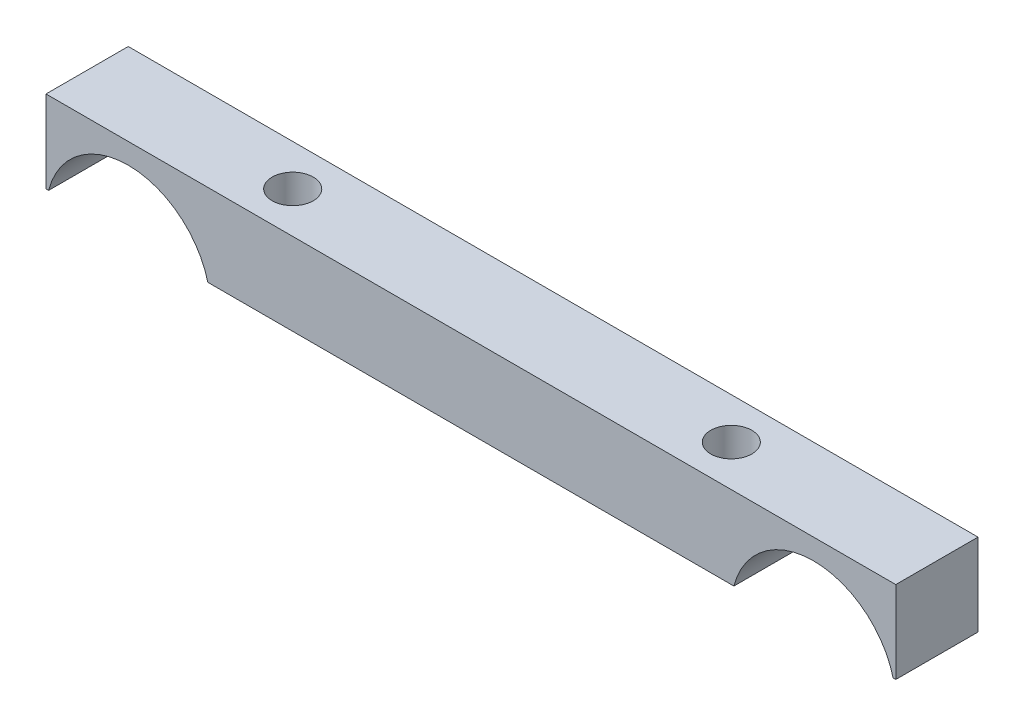
ISO-10303-21;
HEADER;
FILE_DESCRIPTION(('STEP AP214'),'2;1');
FILE_NAME('part.step','',(''),(''),'','','');
FILE_SCHEMA(('AUTOMOTIVE_DESIGN { 1 0 10303 214 1 1 1 1 }'));
ENDSEC;
DATA;
#1=APPLICATION_CONTEXT('core data for automotive mechanical design processes');
#2=APPLICATION_PROTOCOL_DEFINITION('international standard','automotive_design',2000,#1);
#3=PRODUCT_CONTEXT('',#1,'mechanical');
#4=PRODUCT('Part','Part','',(#3));
#5=PRODUCT_RELATED_PRODUCT_CATEGORY('part','',(#4));
#6=PRODUCT_DEFINITION_FORMATION('','',#4);
#7=PRODUCT_DEFINITION_CONTEXT('part definition',#1,'design');
#8=PRODUCT_DEFINITION('design','',#6,#7);
#9=PRODUCT_DEFINITION_SHAPE('','',#8);
#10=(LENGTH_UNIT() NAMED_UNIT(*) SI_UNIT(.MILLI.,.METRE.));
#11=(NAMED_UNIT(*) PLANE_ANGLE_UNIT() SI_UNIT($,.RADIAN.));
#12=(NAMED_UNIT(*) SI_UNIT($,.STERADIAN.) SOLID_ANGLE_UNIT());
#13=UNCERTAINTY_MEASURE_WITH_UNIT(LENGTH_MEASURE(1.E-05),#10,'distance_accuracy_value','');
#14=(GEOMETRIC_REPRESENTATION_CONTEXT(3) GLOBAL_UNCERTAINTY_ASSIGNED_CONTEXT((#13)) GLOBAL_UNIT_ASSIGNED_CONTEXT((#10,
#11,#12)) REPRESENTATION_CONTEXT('',''));
#15=CARTESIAN_POINT('',(0.,0.,0.));
#16=DIRECTION('',(0.,0.,1.));
#17=DIRECTION('',(1.,0.,0.));
#18=AXIS2_PLACEMENT_3D('',#15,#16,#17);
#19=CARTESIAN_POINT('',(-31.,7.5,6.));
#20=DIRECTION('',(0.,-1.,0.));
#21=DIRECTION('',(0.,0.,-1.));
#22=AXIS2_PLACEMENT_3D('',#19,#20,#21);
#23=PLANE('',#22);
#24=CARTESIAN_POINT('',(16.,7.5,3.));
#25=DIRECTION('',(0.,1.,0.));
#26=DIRECTION('',(0.,0.,1.));
#27=AXIS2_PLACEMENT_3D('',#24,#25,#26);
#28=CIRCLE('',#27,1.5);
#29=CARTESIAN_POINT('',(16.,7.5,4.5));
#30=VERTEX_POINT('',#29);
#31=EDGE_CURVE('E186',#30,#30,#28,.T.);
#32=ORIENTED_EDGE('',*,*,#31,.F.);
#33=EDGE_LOOP('',(#32));
#34=FACE_BOUND('',#33,.T.);
#35=CARTESIAN_POINT('',(-16.,7.5,3.));
#36=DIRECTION('',(0.,1.,0.));
#37=DIRECTION('',(0.,0.,1.));
#38=AXIS2_PLACEMENT_3D('',#35,#36,#37);
#39=CIRCLE('',#38,1.5);
#40=CARTESIAN_POINT('',(-16.,7.5,4.5));
#41=VERTEX_POINT('',#40);
#42=EDGE_CURVE('E180',#41,#41,#39,.T.);
#43=ORIENTED_EDGE('',*,*,#42,.F.);
#44=EDGE_LOOP('',(#43));
#45=FACE_BOUND('',#44,.T.);
#46=DIRECTION('',(-1.,0.,0.));
#47=VECTOR('',#46,1.);
#48=CARTESIAN_POINT('',(-31.,7.5,0.));
#49=LINE('',#48,#47);
#50=CARTESIAN_POINT('',(31.,7.5,0.));
#51=VERTEX_POINT('',#50);
#52=CARTESIAN_POINT('',(-31.,7.5,0.));
#53=VERTEX_POINT('',#52);
#54=EDGE_CURVE('E132',#51,#53,#49,.T.);
#55=ORIENTED_EDGE('',*,*,#54,.T.);
#56=DIRECTION('',(0.,0.,-1.));
#57=VECTOR('',#56,1.);
#58=CARTESIAN_POINT('',(-31.,7.5,6.));
#59=LINE('',#58,#57);
#60=CARTESIAN_POINT('',(-31.,7.5,6.));
#61=VERTEX_POINT('',#60);
#62=EDGE_CURVE('E11',#61,#53,#59,.T.);
#63=ORIENTED_EDGE('',*,*,#62,.F.);
#64=DIRECTION('',(-1.,0.,0.));
#65=VECTOR('',#64,1.);
#66=CARTESIAN_POINT('',(-31.,7.5,6.));
#67=LINE('',#66,#65);
#68=CARTESIAN_POINT('',(31.,7.5,6.));
#69=VERTEX_POINT('',#68);
#70=EDGE_CURVE('E147',#69,#61,#67,.T.);
#71=ORIENTED_EDGE('',*,*,#70,.F.);
#72=DIRECTION('',(0.,0.,-1.));
#73=VECTOR('',#72,1.);
#74=CARTESIAN_POINT('',(31.,7.5,6.));
#75=LINE('',#74,#73);
#76=EDGE_CURVE('E128',#69,#51,#75,.T.);
#77=ORIENTED_EDGE('',*,*,#76,.T.);
#78=EDGE_LOOP('',(#55,#63,#71,#77));
#79=FACE_BOUND('',#78,.T.);
#80=ADVANCED_FACE('F36',(#34,#45,#79),#23,.F.);
#81=CARTESIAN_POINT('',(-31.,1.5,6.));
#82=DIRECTION('',(1.,0.,0.));
#83=DIRECTION('',(0.,0.,-1.));
#84=AXIS2_PLACEMENT_3D('',#81,#82,#83);
#85=PLANE('',#84);
#86=DIRECTION('',(0.,-1.,0.));
#87=VECTOR('',#86,1.);
#88=CARTESIAN_POINT('',(-31.,1.5,0.));
#89=LINE('',#88,#87);
#90=CARTESIAN_POINT('',(-31.,1.5,0.));
#91=VERTEX_POINT('',#90);
#92=EDGE_CURVE('E135',#53,#91,#89,.T.);
#93=ORIENTED_EDGE('',*,*,#92,.T.);
#94=DIRECTION('',(0.,0.,-1.));
#95=VECTOR('',#94,1.);
#96=CARTESIAN_POINT('',(-31.,1.5,6.));
#97=LINE('',#96,#95);
#98=CARTESIAN_POINT('',(-31.,1.5,6.));
#99=VERTEX_POINT('',#98);
#100=EDGE_CURVE('E44',#99,#91,#97,.T.);
#101=ORIENTED_EDGE('',*,*,#100,.F.);
#102=DIRECTION('',(0.,-1.,0.));
#103=VECTOR('',#102,1.);
#104=CARTESIAN_POINT('',(-31.,1.5,6.));
#105=LINE('',#104,#103);
#106=EDGE_CURVE('E95',#61,#99,#105,.T.);
#107=ORIENTED_EDGE('',*,*,#106,.F.);
#108=ORIENTED_EDGE('',*,*,#62,.T.);
#109=EDGE_LOOP('',(#93,#101,#107,#108));
#110=FACE_BOUND('',#109,.T.);
#111=ADVANCED_FACE('F203',(#110),#85,.F.);
#112=CARTESIAN_POINT('',(-30.8094750193111,1.5,6.));
#113=DIRECTION('',(0.,1.,0.));
#114=DIRECTION('',(-1.,0.,0.));
#115=AXIS2_PLACEMENT_3D('',#112,#113,#114);
#116=PLANE('',#115);
#117=DIRECTION('',(1.,0.,0.));
#118=VECTOR('',#117,1.);
#119=CARTESIAN_POINT('',(-30.8094750193111,1.5,0.));
#120=LINE('',#119,#118);
#121=CARTESIAN_POINT('',(-30.8094750193111,1.5,0.));
#122=VERTEX_POINT('',#121);
#123=EDGE_CURVE('E138',#91,#122,#120,.T.);
#124=ORIENTED_EDGE('',*,*,#123,.T.);
#125=DIRECTION('',(0.,0.,-1.));
#126=VECTOR('',#125,1.);
#127=CARTESIAN_POINT('',(-30.8094750193111,1.5,6.));
#128=LINE('',#127,#126);
#129=CARTESIAN_POINT('',(-30.8094750193111,1.5,6.));
#130=VERTEX_POINT('',#129);
#131=EDGE_CURVE('E154',#130,#122,#128,.T.);
#132=ORIENTED_EDGE('',*,*,#131,.F.);
#133=DIRECTION('',(1.,0.,0.));
#134=VECTOR('',#133,1.);
#135=CARTESIAN_POINT('',(-30.8094750193111,1.5,6.));
#136=LINE('',#135,#134);
#137=EDGE_CURVE('E162',#99,#130,#136,.T.);
#138=ORIENTED_EDGE('',*,*,#137,.F.);
#139=ORIENTED_EDGE('',*,*,#100,.T.);
#140=EDGE_LOOP('',(#124,#132,#138,#139));
#141=FACE_BOUND('',#140,.T.);
#142=ADVANCED_FACE('F160',(#141),#116,.F.);
#143=CARTESIAN_POINT('',(-25.,0.,6.));
#144=DIRECTION('',(0.,0.,-1.));
#145=DIRECTION('',(-1.,0.,0.));
#146=AXIS2_PLACEMENT_3D('',#143,#144,#145);
#147=CYLINDRICAL_SURFACE('',#146,6.);
#148=CARTESIAN_POINT('',(-25.,0.,0.));
#149=DIRECTION('',(0.,0.,-1.));
#150=DIRECTION('',(1.,0.,0.));
#151=AXIS2_PLACEMENT_3D('',#148,#149,#150);
#152=CIRCLE('',#151,6.);
#153=CARTESIAN_POINT('',(-19.1905249806889,1.5,0.));
#154=VERTEX_POINT('',#153);
#155=EDGE_CURVE('E140',#122,#154,#152,.T.);
#156=ORIENTED_EDGE('',*,*,#155,.T.);
#157=DIRECTION('',(0.,0.,-1.));
#158=VECTOR('',#157,1.);
#159=CARTESIAN_POINT('',(-19.1905249806889,1.5,6.));
#160=LINE('',#159,#158);
#161=CARTESIAN_POINT('',(-19.1905249806889,1.5,6.));
#162=VERTEX_POINT('',#161);
#163=EDGE_CURVE('E151',#162,#154,#160,.T.);
#164=ORIENTED_EDGE('',*,*,#163,.F.);
#165=CARTESIAN_POINT('',(-25.,0.,6.));
#166=DIRECTION('',(0.,0.,-1.));
#167=DIRECTION('',(1.,0.,0.));
#168=AXIS2_PLACEMENT_3D('',#165,#166,#167);
#169=CIRCLE('',#168,6.);
#170=EDGE_CURVE('E174',#130,#162,#169,.T.);
#171=ORIENTED_EDGE('',*,*,#170,.F.);
#172=ORIENTED_EDGE('',*,*,#131,.T.);
#173=EDGE_LOOP('',(#156,#164,#171,#172));
#174=FACE_BOUND('',#173,.T.);
#175=ADVANCED_FACE('F170',(#174),#147,.F.);
#176=CARTESIAN_POINT('',(-19.1905249806889,1.5,6.));
#177=DIRECTION('',(0.,1.,0.));
#178=DIRECTION('',(0.,0.,1.));
#179=AXIS2_PLACEMENT_3D('',#176,#177,#178);
#180=PLANE('',#179);
#181=CARTESIAN_POINT('',(16.,1.5,3.));
#182=DIRECTION('',(0.,1.,0.));
#183=DIRECTION('',(0.,0.,1.));
#184=AXIS2_PLACEMENT_3D('',#181,#182,#183);
#185=CIRCLE('',#184,1.5);
#186=CARTESIAN_POINT('',(16.,1.5,4.5));
#187=VERTEX_POINT('',#186);
#188=EDGE_CURVE('E183',#187,#187,#185,.T.);
#189=ORIENTED_EDGE('',*,*,#188,.T.);
#190=EDGE_LOOP('',(#189));
#191=FACE_BOUND('',#190,.T.);
#192=CARTESIAN_POINT('',(-16.,1.5,3.));
#193=DIRECTION('',(0.,1.,0.));
#194=DIRECTION('',(0.,0.,1.));
#195=AXIS2_PLACEMENT_3D('',#192,#193,#194);
#196=CIRCLE('',#195,1.5);
#197=CARTESIAN_POINT('',(-16.,1.5,4.5));
#198=VERTEX_POINT('',#197);
#199=EDGE_CURVE('E136',#198,#198,#196,.T.);
#200=ORIENTED_EDGE('',*,*,#199,.T.);
#201=EDGE_LOOP('',(#200));
#202=FACE_BOUND('',#201,.T.);
#203=DIRECTION('',(1.,0.,0.));
#204=VECTOR('',#203,1.);
#205=CARTESIAN_POINT('',(-19.1905249806889,1.5,0.));
#206=LINE('',#205,#204);
#207=CARTESIAN_POINT('',(19.1905249806889,1.5,0.));
#208=VERTEX_POINT('',#207);
#209=EDGE_CURVE('E142',#154,#208,#206,.T.);
#210=ORIENTED_EDGE('',*,*,#209,.T.);
#211=DIRECTION('',(0.,0.,-1.));
#212=VECTOR('',#211,1.);
#213=CARTESIAN_POINT('',(19.1905249806889,1.5,6.));
#214=LINE('',#213,#212);
#215=CARTESIAN_POINT('',(19.1905249806889,1.5,6.));
#216=VERTEX_POINT('',#215);
#217=EDGE_CURVE('E123',#216,#208,#214,.T.);
#218=ORIENTED_EDGE('',*,*,#217,.F.);
#219=DIRECTION('',(1.,0.,0.));
#220=VECTOR('',#219,1.);
#221=CARTESIAN_POINT('',(-19.1905249806889,1.5,6.));
#222=LINE('',#221,#220);
#223=EDGE_CURVE('E114',#162,#216,#222,.T.);
#224=ORIENTED_EDGE('',*,*,#223,.F.);
#225=ORIENTED_EDGE('',*,*,#163,.T.);
#226=EDGE_LOOP('',(#210,#218,#224,#225));
#227=FACE_BOUND('',#226,.T.);
#228=ADVANCED_FACE('F173',(#191,#202,#227),#180,.F.);
#229=CARTESIAN_POINT('',(25.,0.,6.));
#230=DIRECTION('',(0.,0.,-1.));
#231=DIRECTION('',(-1.,0.,0.));
#232=AXIS2_PLACEMENT_3D('',#229,#230,#231);
#233=CYLINDRICAL_SURFACE('',#232,6.);
#234=CARTESIAN_POINT('',(25.,0.,0.));
#235=DIRECTION('',(0.,0.,-1.));
#236=DIRECTION('',(-1.,0.,0.));
#237=AXIS2_PLACEMENT_3D('',#234,#235,#236);
#238=CIRCLE('',#237,6.);
#239=CARTESIAN_POINT('',(30.8094750193111,1.5,0.));
#240=VERTEX_POINT('',#239);
#241=EDGE_CURVE('E122',#208,#240,#238,.T.);
#242=ORIENTED_EDGE('',*,*,#241,.T.);
#243=DIRECTION('',(0.,0.,-1.));
#244=VECTOR('',#243,1.);
#245=CARTESIAN_POINT('',(30.8094750193111,1.5,6.));
#246=LINE('',#245,#244);
#247=CARTESIAN_POINT('',(30.8094750193111,1.5,6.));
#248=VERTEX_POINT('',#247);
#249=EDGE_CURVE('E119',#248,#240,#246,.T.);
#250=ORIENTED_EDGE('',*,*,#249,.F.);
#251=CARTESIAN_POINT('',(25.,0.,6.));
#252=DIRECTION('',(0.,0.,-1.));
#253=DIRECTION('',(-1.,0.,0.));
#254=AXIS2_PLACEMENT_3D('',#251,#252,#253);
#255=CIRCLE('',#254,6.);
#256=EDGE_CURVE('E108',#216,#248,#255,.T.);
#257=ORIENTED_EDGE('',*,*,#256,.F.);
#258=ORIENTED_EDGE('',*,*,#217,.T.);
#259=EDGE_LOOP('',(#242,#250,#257,#258));
#260=FACE_BOUND('',#259,.T.);
#261=ADVANCED_FACE('F120',(#260),#233,.F.);
#262=CARTESIAN_POINT('',(31.,1.5,6.));
#263=DIRECTION('',(0.,1.,0.));
#264=DIRECTION('',(0.,0.,1.));
#265=AXIS2_PLACEMENT_3D('',#262,#263,#264);
#266=PLANE('',#265);
#267=DIRECTION('',(1.,0.,0.));
#268=VECTOR('',#267,1.);
#269=CARTESIAN_POINT('',(31.,1.5,0.));
#270=LINE('',#269,#268);
#271=CARTESIAN_POINT('',(31.,1.5,0.));
#272=VERTEX_POINT('',#271);
#273=EDGE_CURVE('E81',#240,#272,#270,.T.);
#274=ORIENTED_EDGE('',*,*,#273,.T.);
#275=DIRECTION('',(0.,0.,-1.));
#276=VECTOR('',#275,1.);
#277=CARTESIAN_POINT('',(31.,1.5,6.));
#278=LINE('',#277,#276);
#279=CARTESIAN_POINT('',(31.,1.5,6.));
#280=VERTEX_POINT('',#279);
#281=EDGE_CURVE('E124',#280,#272,#278,.T.);
#282=ORIENTED_EDGE('',*,*,#281,.F.);
#283=DIRECTION('',(1.,0.,0.));
#284=VECTOR('',#283,1.);
#285=CARTESIAN_POINT('',(31.,1.5,6.));
#286=LINE('',#285,#284);
#287=EDGE_CURVE('E112',#248,#280,#286,.T.);
#288=ORIENTED_EDGE('',*,*,#287,.F.);
#289=ORIENTED_EDGE('',*,*,#249,.T.);
#290=EDGE_LOOP('',(#274,#282,#288,#289));
#291=FACE_BOUND('',#290,.T.);
#292=ADVANCED_FACE('F126',(#291),#266,.F.);
#293=CARTESIAN_POINT('',(31.,7.5,6.));
#294=DIRECTION('',(-1.,0.,0.));
#295=DIRECTION('',(0.,-1.,0.));
#296=AXIS2_PLACEMENT_3D('',#293,#294,#295);
#297=PLANE('',#296);
#298=DIRECTION('',(0.,1.,0.));
#299=VECTOR('',#298,1.);
#300=CARTESIAN_POINT('',(31.,7.5,0.));
#301=LINE('',#300,#299);
#302=EDGE_CURVE('E87',#272,#51,#301,.T.);
#303=ORIENTED_EDGE('',*,*,#302,.T.);
#304=ORIENTED_EDGE('',*,*,#76,.F.);
#305=DIRECTION('',(0.,1.,0.));
#306=VECTOR('',#305,1.);
#307=CARTESIAN_POINT('',(31.,7.5,6.));
#308=LINE('',#307,#306);
#309=EDGE_CURVE('E52',#280,#69,#308,.T.);
#310=ORIENTED_EDGE('',*,*,#309,.F.);
#311=ORIENTED_EDGE('',*,*,#281,.T.);
#312=EDGE_LOOP('',(#303,#304,#310,#311));
#313=FACE_BOUND('',#312,.T.);
#314=ADVANCED_FACE('F208',(#313),#297,.F.);
#315=CARTESIAN_POINT('',(25.,0.,6.));
#316=DIRECTION('',(0.,0.,-1.));
#317=DIRECTION('',(-1.,0.,0.));
#318=AXIS2_PLACEMENT_3D('',#315,#316,#317);
#319=PLANE('',#318);
#320=ORIENTED_EDGE('',*,*,#70,.T.);
#321=ORIENTED_EDGE('',*,*,#106,.T.);
#322=ORIENTED_EDGE('',*,*,#137,.T.);
#323=ORIENTED_EDGE('',*,*,#170,.T.);
#324=ORIENTED_EDGE('',*,*,#223,.T.);
#325=ORIENTED_EDGE('',*,*,#256,.T.);
#326=ORIENTED_EDGE('',*,*,#287,.T.);
#327=ORIENTED_EDGE('',*,*,#309,.T.);
#328=EDGE_LOOP('',(#320,#321,#322,#323,#324,#325,#326,#327));
#329=FACE_BOUND('',#328,.T.);
#330=ADVANCED_FACE('F110',(#329),#319,.F.);
#331=CARTESIAN_POINT('',(25.,0.,0.));
#332=DIRECTION('',(0.,0.,-1.));
#333=DIRECTION('',(-1.,0.,0.));
#334=AXIS2_PLACEMENT_3D('',#331,#332,#333);
#335=PLANE('',#334);
#336=ORIENTED_EDGE('',*,*,#54,.F.);
#337=ORIENTED_EDGE('',*,*,#302,.F.);
#338=ORIENTED_EDGE('',*,*,#273,.F.);
#339=ORIENTED_EDGE('',*,*,#241,.F.);
#340=ORIENTED_EDGE('',*,*,#209,.F.);
#341=ORIENTED_EDGE('',*,*,#155,.F.);
#342=ORIENTED_EDGE('',*,*,#123,.F.);
#343=ORIENTED_EDGE('',*,*,#92,.F.);
#344=EDGE_LOOP('',(#336,#337,#338,#339,#340,#341,#342,#343));
#345=FACE_BOUND('',#344,.T.);
#346=ADVANCED_FACE('F166',(#345),#335,.T.);
#347=CARTESIAN_POINT('',(-16.,1.5,3.));
#348=DIRECTION('',(0.,1.,0.));
#349=DIRECTION('',(0.,0.,1.));
#350=AXIS2_PLACEMENT_3D('',#347,#348,#349);
#351=CYLINDRICAL_SURFACE('',#350,1.5);
#352=ORIENTED_EDGE('',*,*,#199,.F.);
#353=EDGE_LOOP('',(#352));
#354=FACE_BOUND('',#353,.T.);
#355=ORIENTED_EDGE('',*,*,#42,.T.);
#356=EDGE_LOOP('',(#355));
#357=FACE_BOUND('',#356,.T.);
#358=ADVANCED_FACE('F197',(#354,#357),#351,.F.);
#359=CARTESIAN_POINT('',(16.,1.5,3.));
#360=DIRECTION('',(0.,1.,0.));
#361=DIRECTION('',(0.,0.,1.));
#362=AXIS2_PLACEMENT_3D('',#359,#360,#361);
#363=CYLINDRICAL_SURFACE('',#362,1.5);
#364=ORIENTED_EDGE('',*,*,#188,.F.);
#365=EDGE_LOOP('',(#364));
#366=FACE_BOUND('',#365,.T.);
#367=ORIENTED_EDGE('',*,*,#31,.T.);
#368=EDGE_LOOP('',(#367));
#369=FACE_BOUND('',#368,.T.);
#370=ADVANCED_FACE('F194',(#366,#369),#363,.F.);
#371=CLOSED_SHELL('',(#80,#111,#142,#175,#228,#261,#292,#314,#330,#346,#358,#370));
#372=MANIFOLD_SOLID_BREP('B2',#371);
#373=ADVANCED_BREP_SHAPE_REPRESENTATION('',(#18,#372),#14);
#374=SHAPE_DEFINITION_REPRESENTATION(#9,#373);
ENDSEC;
END-ISO-10303-21;
